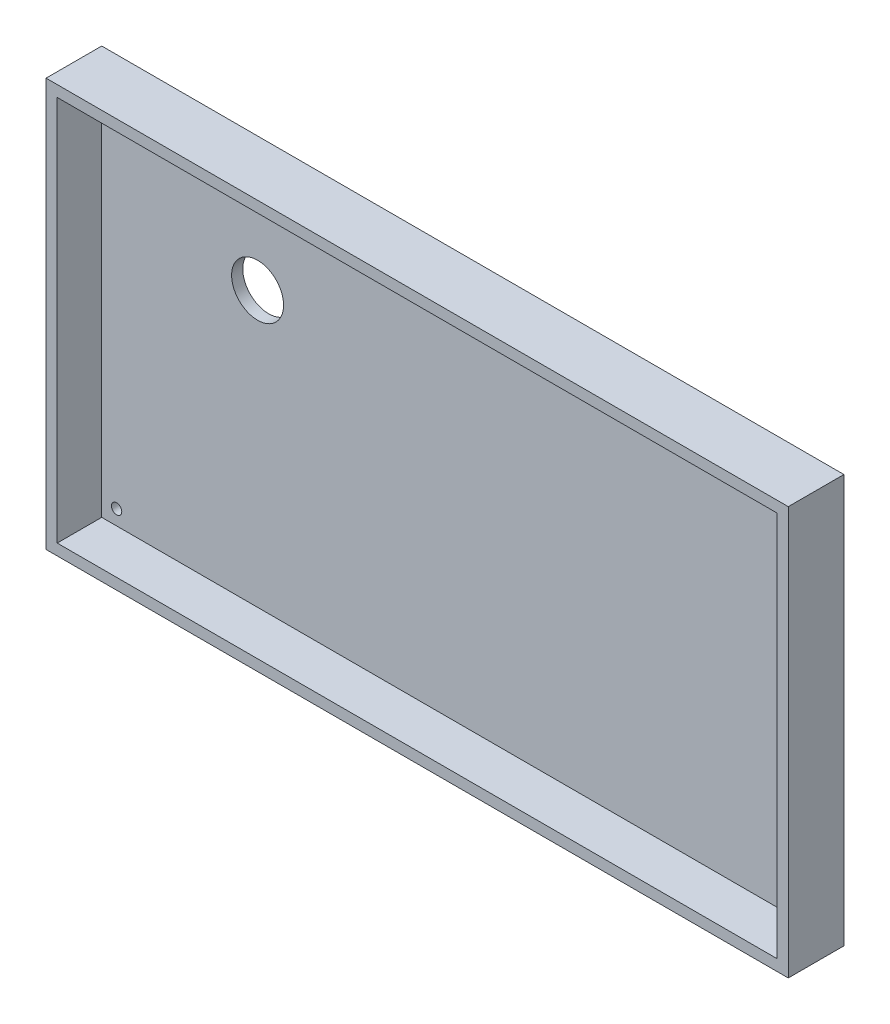
ISO-10303-21;
HEADER;
FILE_DESCRIPTION(('STEP AP214'),'2;1');
FILE_NAME('part.step','',(''),(''),'','','');
FILE_SCHEMA(('AUTOMOTIVE_DESIGN { 1 0 10303 214 1 1 1 1 }'));
ENDSEC;
DATA;
#1=APPLICATION_CONTEXT('core data for automotive mechanical design processes');
#2=APPLICATION_PROTOCOL_DEFINITION('international standard','automotive_design',2000,#1);
#3=PRODUCT_CONTEXT('',#1,'mechanical');
#4=PRODUCT('Part','Part','',(#3));
#5=PRODUCT_RELATED_PRODUCT_CATEGORY('part','',(#4));
#6=PRODUCT_DEFINITION_FORMATION('','',#4);
#7=PRODUCT_DEFINITION_CONTEXT('part definition',#1,'design');
#8=PRODUCT_DEFINITION('design','',#6,#7);
#9=PRODUCT_DEFINITION_SHAPE('','',#8);
#10=(LENGTH_UNIT() NAMED_UNIT(*) SI_UNIT(.MILLI.,.METRE.));
#11=(NAMED_UNIT(*) PLANE_ANGLE_UNIT() SI_UNIT($,.RADIAN.));
#12=(NAMED_UNIT(*) SI_UNIT($,.STERADIAN.) SOLID_ANGLE_UNIT());
#13=UNCERTAINTY_MEASURE_WITH_UNIT(LENGTH_MEASURE(1.E-05),#10,'distance_accuracy_value','');
#14=(GEOMETRIC_REPRESENTATION_CONTEXT(3) GLOBAL_UNCERTAINTY_ASSIGNED_CONTEXT((#13)) GLOBAL_UNIT_ASSIGNED_CONTEXT((#10,
#11,#12)) REPRESENTATION_CONTEXT('',''));
#15=CARTESIAN_POINT('',(0.,0.,0.));
#16=DIRECTION('',(0.,0.,1.));
#17=DIRECTION('',(1.,0.,0.));
#18=AXIS2_PLACEMENT_3D('',#15,#16,#17);
#19=CARTESIAN_POINT('',(-96.0084033613445,31.3025210084034,3.));
#20=DIRECTION('',(1.,0.,0.));
#21=DIRECTION('',(0.,0.,-1.));
#22=AXIS2_PLACEMENT_3D('',#19,#20,#21);
#23=PLANE('',#22);
#24=DIRECTION('',(0.,-1.,0.));
#25=VECTOR('',#24,1.);
#26=CARTESIAN_POINT('',(-96.0084033613445,31.3025210084034,0.));
#27=LINE('',#26,#25);
#28=CARTESIAN_POINT('',(-96.0084033613445,31.3025210084034,0.));
#29=VERTEX_POINT('',#28);
#30=CARTESIAN_POINT('',(-96.0084033613445,-78.6974789915967,0.));
#31=VERTEX_POINT('',#30);
#32=EDGE_CURVE('E158',#29,#31,#27,.T.);
#33=ORIENTED_EDGE('',*,*,#32,.T.);
#34=DIRECTION('',(0.,0.,-1.));
#35=VECTOR('',#34,1.);
#36=CARTESIAN_POINT('',(-96.0084033613445,-78.6974789915967,3.));
#37=LINE('',#36,#35);
#38=CARTESIAN_POINT('',(-96.0084033613445,-78.6974789915967,15.));
#39=VERTEX_POINT('',#38);
#40=EDGE_CURVE('E11',#39,#31,#37,.T.);
#41=ORIENTED_EDGE('',*,*,#40,.F.);
#42=DIRECTION('',(0.,-1.,0.));
#43=VECTOR('',#42,1.);
#44=CARTESIAN_POINT('',(-96.0084033613445,31.3025210084034,15.));
#45=LINE('',#44,#43);
#46=CARTESIAN_POINT('',(-96.0084033613445,31.3025210084034,15.));
#47=VERTEX_POINT('',#46);
#48=EDGE_CURVE('E121',#47,#39,#45,.T.);
#49=ORIENTED_EDGE('',*,*,#48,.F.);
#50=DIRECTION('',(0.,0.,-1.));
#51=VECTOR('',#50,1.);
#52=CARTESIAN_POINT('',(-96.0084033613445,31.3025210084034,3.));
#53=LINE('',#52,#51);
#54=EDGE_CURVE('E167',#47,#29,#53,.T.);
#55=ORIENTED_EDGE('',*,*,#54,.T.);
#56=EDGE_LOOP('',(#33,#41,#49,#55));
#57=FACE_BOUND('',#56,.T.);
#58=ADVANCED_FACE('F39',(#57),#23,.F.);
#59=CARTESIAN_POINT('',(-96.0084033613445,-78.6974789915967,3.));
#60=DIRECTION('',(0.,1.,0.));
#61=DIRECTION('',(0.,0.,1.));
#62=AXIS2_PLACEMENT_3D('',#59,#60,#61);
#63=PLANE('',#62);
#64=DIRECTION('',(1.,0.,0.));
#65=VECTOR('',#64,1.);
#66=CARTESIAN_POINT('',(-96.0084033613445,-78.6974789915967,0.));
#67=LINE('',#66,#65);
#68=CARTESIAN_POINT('',(103.991596638655,-78.6974789915967,0.));
#69=VERTEX_POINT('',#68);
#70=EDGE_CURVE('E161',#31,#69,#67,.T.);
#71=ORIENTED_EDGE('',*,*,#70,.T.);
#72=DIRECTION('',(0.,0.,-1.));
#73=VECTOR('',#72,1.);
#74=CARTESIAN_POINT('',(103.991596638655,-78.6974789915967,3.));
#75=LINE('',#74,#73);
#76=CARTESIAN_POINT('',(103.991596638655,-78.6974789915967,15.));
#77=VERTEX_POINT('',#76);
#78=EDGE_CURVE('E46',#77,#69,#75,.T.);
#79=ORIENTED_EDGE('',*,*,#78,.F.);
#80=DIRECTION('',(1.,0.,0.));
#81=VECTOR('',#80,1.);
#82=CARTESIAN_POINT('',(-96.0084033613445,-78.6974789915967,15.));
#83=LINE('',#82,#81);
#84=EDGE_CURVE('E149',#39,#77,#83,.T.);
#85=ORIENTED_EDGE('',*,*,#84,.F.);
#86=ORIENTED_EDGE('',*,*,#40,.T.);
#87=EDGE_LOOP('',(#71,#79,#85,#86));
#88=FACE_BOUND('',#87,.T.);
#89=ADVANCED_FACE('F184',(#88),#63,.F.);
#90=CARTESIAN_POINT('',(103.991596638655,31.3025210084034,3.));
#91=DIRECTION('',(-1.,0.,0.));
#92=DIRECTION('',(0.,-1.,0.));
#93=AXIS2_PLACEMENT_3D('',#90,#91,#92);
#94=PLANE('',#93);
#95=DIRECTION('',(0.,1.,0.));
#96=VECTOR('',#95,1.);
#97=CARTESIAN_POINT('',(103.991596638655,31.3025210084034,0.));
#98=LINE('',#97,#96);
#99=CARTESIAN_POINT('',(103.991596638655,31.3025210084034,0.));
#100=VERTEX_POINT('',#99);
#101=EDGE_CURVE('E162',#69,#100,#98,.T.);
#102=ORIENTED_EDGE('',*,*,#101,.T.);
#103=DIRECTION('',(0.,0.,-1.));
#104=VECTOR('',#103,1.);
#105=CARTESIAN_POINT('',(103.991596638655,31.3025210084034,3.));
#106=LINE('',#105,#104);
#107=CARTESIAN_POINT('',(103.991596638655,31.3025210084034,15.));
#108=VERTEX_POINT('',#107);
#109=EDGE_CURVE('E169',#108,#100,#106,.T.);
#110=ORIENTED_EDGE('',*,*,#109,.F.);
#111=DIRECTION('',(0.,1.,0.));
#112=VECTOR('',#111,1.);
#113=CARTESIAN_POINT('',(103.991596638655,31.3025210084034,15.));
#114=LINE('',#113,#112);
#115=EDGE_CURVE('E155',#77,#108,#114,.T.);
#116=ORIENTED_EDGE('',*,*,#115,.F.);
#117=ORIENTED_EDGE('',*,*,#78,.T.);
#118=EDGE_LOOP('',(#102,#110,#116,#117));
#119=FACE_BOUND('',#118,.T.);
#120=ADVANCED_FACE('F175',(#119),#94,.F.);
#121=CARTESIAN_POINT('',(-96.0084033613445,31.3025210084034,3.));
#122=DIRECTION('',(0.,-1.,0.));
#123=DIRECTION('',(0.,0.,-1.));
#124=AXIS2_PLACEMENT_3D('',#121,#122,#123);
#125=PLANE('',#124);
#126=DIRECTION('',(-1.,0.,0.));
#127=VECTOR('',#126,1.);
#128=CARTESIAN_POINT('',(-96.0084033613445,31.3025210084034,0.));
#129=LINE('',#128,#127);
#130=EDGE_CURVE('E64',#100,#29,#129,.T.);
#131=ORIENTED_EDGE('',*,*,#130,.T.);
#132=ORIENTED_EDGE('',*,*,#54,.F.);
#133=DIRECTION('',(-1.,0.,0.));
#134=VECTOR('',#133,1.);
#135=CARTESIAN_POINT('',(-96.0084033613445,31.3025210084034,15.));
#136=LINE('',#135,#134);
#137=EDGE_CURVE('E154',#108,#47,#136,.T.);
#138=ORIENTED_EDGE('',*,*,#137,.F.);
#139=ORIENTED_EDGE('',*,*,#109,.T.);
#140=EDGE_LOOP('',(#131,#132,#138,#139));
#141=FACE_BOUND('',#140,.T.);
#142=ADVANCED_FACE('F185',(#141),#125,.F.);
#143=CARTESIAN_POINT('',(0.,0.,0.));
#144=DIRECTION('',(0.,0.,1.));
#145=DIRECTION('',(1.,0.,0.));
#146=AXIS2_PLACEMENT_3D('',#143,#144,#145);
#147=PLANE('',#146);
#148=CARTESIAN_POINT('',(-51.0084033613446,-1.69747899159664,0.));
#149=DIRECTION('',(0.,0.,1.));
#150=DIRECTION('',(1.,0.,0.));
#151=AXIS2_PLACEMENT_3D('',#148,#149,#150);
#152=CIRCLE('',#151,7.);
#153=CARTESIAN_POINT('',(-44.0084033613446,-1.69747899159664,0.));
#154=VERTEX_POINT('',#153);
#155=EDGE_CURVE('E236',#154,#154,#152,.T.);
#156=ORIENTED_EDGE('',*,*,#155,.T.);
#157=EDGE_LOOP('',(#156));
#158=FACE_BOUND('',#157,.T.);
#159=CARTESIAN_POINT('',(-89.0084033613445,-71.6974789915967,0.));
#160=DIRECTION('',(0.,0.,1.));
#161=DIRECTION('',(1.,0.,0.));
#162=AXIS2_PLACEMENT_3D('',#159,#160,#161);
#163=CIRCLE('',#162,1.4);
#164=CARTESIAN_POINT('',(-87.6084033613445,-71.6974789915967,0.));
#165=VERTEX_POINT('',#164);
#166=EDGE_CURVE('E258',#165,#165,#163,.T.);
#167=ORIENTED_EDGE('',*,*,#166,.T.);
#168=EDGE_LOOP('',(#167));
#169=FACE_BOUND('',#168,.T.);
#170=CARTESIAN_POINT('',(96.9915966386555,24.3025210084034,0.));
#171=DIRECTION('',(0.,0.,1.));
#172=DIRECTION('',(1.,0.,0.));
#173=AXIS2_PLACEMENT_3D('',#170,#171,#172);
#174=CIRCLE('',#173,1.4);
#175=CARTESIAN_POINT('',(98.3915966386555,24.3025210084034,0.));
#176=VERTEX_POINT('',#175);
#177=EDGE_CURVE('E248',#176,#176,#174,.T.);
#178=ORIENTED_EDGE('',*,*,#177,.T.);
#179=EDGE_LOOP('',(#178));
#180=FACE_BOUND('',#179,.T.);
#181=CARTESIAN_POINT('',(96.9915966386555,-71.6974789915967,0.));
#182=DIRECTION('',(0.,0.,1.));
#183=DIRECTION('',(1.,0.,0.));
#184=AXIS2_PLACEMENT_3D('',#181,#182,#183);
#185=CIRCLE('',#184,1.4);
#186=CARTESIAN_POINT('',(98.3915966386555,-71.6974789915967,0.));
#187=VERTEX_POINT('',#186);
#188=EDGE_CURVE('E245',#187,#187,#185,.T.);
#189=ORIENTED_EDGE('',*,*,#188,.T.);
#190=EDGE_LOOP('',(#189));
#191=FACE_BOUND('',#190,.T.);
#192=CARTESIAN_POINT('',(-89.0084033613445,24.3025210084034,0.));
#193=DIRECTION('',(0.,0.,1.));
#194=DIRECTION('',(1.,0.,0.));
#195=AXIS2_PLACEMENT_3D('',#192,#193,#194);
#196=CIRCLE('',#195,1.4);
#197=CARTESIAN_POINT('',(-87.6084033613445,24.3025210084034,0.));
#198=VERTEX_POINT('',#197);
#199=EDGE_CURVE('E136',#198,#198,#196,.T.);
#200=ORIENTED_EDGE('',*,*,#199,.T.);
#201=EDGE_LOOP('',(#200));
#202=FACE_BOUND('',#201,.T.);
#203=ORIENTED_EDGE('',*,*,#32,.F.);
#204=ORIENTED_EDGE('',*,*,#130,.F.);
#205=ORIENTED_EDGE('',*,*,#101,.F.);
#206=ORIENTED_EDGE('',*,*,#70,.F.);
#207=EDGE_LOOP('',(#203,#204,#205,#206));
#208=FACE_BOUND('',#207,.T.);
#209=ADVANCED_FACE('F179',(#158,#169,#180,#191,#202,#208),#147,.F.);
#210=CARTESIAN_POINT('',(0.,0.,15.));
#211=DIRECTION('',(0.,0.,1.));
#212=DIRECTION('',(1.,0.,0.));
#213=AXIS2_PLACEMENT_3D('',#210,#211,#212);
#214=PLANE('',#213);
#215=ORIENTED_EDGE('',*,*,#48,.T.);
#216=ORIENTED_EDGE('',*,*,#84,.T.);
#217=ORIENTED_EDGE('',*,*,#115,.T.);
#218=ORIENTED_EDGE('',*,*,#137,.T.);
#219=EDGE_LOOP('',(#215,#216,#217,#218));
#220=FACE_BOUND('',#219,.T.);
#221=DIRECTION('',(1.,0.,0.));
#222=VECTOR('',#221,1.);
#223=CARTESIAN_POINT('',(-93.0084033613445,-75.6974789915967,15.));
#224=LINE('',#223,#222);
#225=CARTESIAN_POINT('',(-93.0084033613445,-75.6974789915967,15.));
#226=VERTEX_POINT('',#225);
#227=CARTESIAN_POINT('',(100.991596638655,-75.6974789915967,15.));
#228=VERTEX_POINT('',#227);
#229=EDGE_CURVE('E114',#226,#228,#224,.T.);
#230=ORIENTED_EDGE('',*,*,#229,.F.);
#231=DIRECTION('',(0.,-1.,0.));
#232=VECTOR('',#231,1.);
#233=CARTESIAN_POINT('',(-93.0084033613445,28.3025210084034,15.));
#234=LINE('',#233,#232);
#235=CARTESIAN_POINT('',(-93.0084033613445,28.3025210084034,15.));
#236=VERTEX_POINT('',#235);
#237=EDGE_CURVE('E104',#236,#226,#234,.T.);
#238=ORIENTED_EDGE('',*,*,#237,.F.);
#239=DIRECTION('',(-1.,0.,0.));
#240=VECTOR('',#239,1.);
#241=CARTESIAN_POINT('',(-93.0084033613445,28.3025210084034,15.));
#242=LINE('',#241,#240);
#243=CARTESIAN_POINT('',(100.991596638655,28.3025210084034,15.));
#244=VERTEX_POINT('',#243);
#245=EDGE_CURVE('E129',#244,#236,#242,.T.);
#246=ORIENTED_EDGE('',*,*,#245,.F.);
#247=DIRECTION('',(0.,1.,0.));
#248=VECTOR('',#247,1.);
#249=CARTESIAN_POINT('',(100.991596638655,28.3025210084034,15.));
#250=LINE('',#249,#248);
#251=EDGE_CURVE('E130',#228,#244,#250,.T.);
#252=ORIENTED_EDGE('',*,*,#251,.F.);
#253=EDGE_LOOP('',(#230,#238,#246,#252));
#254=FACE_BOUND('',#253,.T.);
#255=ADVANCED_FACE('F125',(#220,#254),#214,.T.);
#256=CARTESIAN_POINT('',(-93.0084033613445,28.3025210084034,15.));
#257=DIRECTION('',(1.,0.,0.));
#258=DIRECTION('',(0.,1.,0.));
#259=AXIS2_PLACEMENT_3D('',#256,#257,#258);
#260=PLANE('',#259);
#261=DIRECTION('',(0.,-1.,0.));
#262=VECTOR('',#261,1.);
#263=CARTESIAN_POINT('',(-93.0084033613445,28.3025210084034,3.));
#264=LINE('',#263,#262);
#265=CARTESIAN_POINT('',(-93.0084033613445,28.3025210084034,3.));
#266=VERTEX_POINT('',#265);
#267=CARTESIAN_POINT('',(-93.0084033613445,-75.6974789915967,3.));
#268=VERTEX_POINT('',#267);
#269=EDGE_CURVE('E133',#266,#268,#264,.T.);
#270=ORIENTED_EDGE('',*,*,#269,.F.);
#271=DIRECTION('',(0.,0.,-1.));
#272=VECTOR('',#271,1.);
#273=CARTESIAN_POINT('',(-93.0084033613445,28.3025210084034,15.));
#274=LINE('',#273,#272);
#275=EDGE_CURVE('E52',#236,#266,#274,.T.);
#276=ORIENTED_EDGE('',*,*,#275,.F.);
#277=ORIENTED_EDGE('',*,*,#237,.T.);
#278=DIRECTION('',(0.,0.,-1.));
#279=VECTOR('',#278,1.);
#280=CARTESIAN_POINT('',(-93.0084033613445,-75.6974789915967,15.));
#281=LINE('',#280,#279);
#282=EDGE_CURVE('E107',#226,#268,#281,.T.);
#283=ORIENTED_EDGE('',*,*,#282,.T.);
#284=EDGE_LOOP('',(#270,#276,#277,#283));
#285=FACE_BOUND('',#284,.T.);
#286=ADVANCED_FACE('F110',(#285),#260,.T.);
#287=CARTESIAN_POINT('',(-93.0084033613445,-75.6974789915967,15.));
#288=DIRECTION('',(0.,1.,0.));
#289=DIRECTION('',(0.,0.,1.));
#290=AXIS2_PLACEMENT_3D('',#287,#288,#289);
#291=PLANE('',#290);
#292=DIRECTION('',(1.,0.,0.));
#293=VECTOR('',#292,1.);
#294=CARTESIAN_POINT('',(-93.0084033613445,-75.6974789915967,3.));
#295=LINE('',#294,#293);
#296=CARTESIAN_POINT('',(100.991596638655,-75.6974789915967,3.));
#297=VERTEX_POINT('',#296);
#298=EDGE_CURVE('E117',#268,#297,#295,.T.);
#299=ORIENTED_EDGE('',*,*,#298,.F.);
#300=ORIENTED_EDGE('',*,*,#282,.F.);
#301=ORIENTED_EDGE('',*,*,#229,.T.);
#302=DIRECTION('',(0.,0.,-1.));
#303=VECTOR('',#302,1.);
#304=CARTESIAN_POINT('',(100.991596638655,-75.6974789915967,15.));
#305=LINE('',#304,#303);
#306=EDGE_CURVE('E122',#228,#297,#305,.T.);
#307=ORIENTED_EDGE('',*,*,#306,.T.);
#308=EDGE_LOOP('',(#299,#300,#301,#307));
#309=FACE_BOUND('',#308,.T.);
#310=ADVANCED_FACE('F116',(#309),#291,.T.);
#311=CARTESIAN_POINT('',(100.991596638655,28.3025210084034,15.));
#312=DIRECTION('',(-1.,0.,0.));
#313=DIRECTION('',(0.,-1.,0.));
#314=AXIS2_PLACEMENT_3D('',#311,#312,#313);
#315=PLANE('',#314);
#316=DIRECTION('',(0.,1.,0.));
#317=VECTOR('',#316,1.);
#318=CARTESIAN_POINT('',(100.991596638655,28.3025210084034,3.));
#319=LINE('',#318,#317);
#320=CARTESIAN_POINT('',(100.991596638655,28.3025210084034,3.));
#321=VERTEX_POINT('',#320);
#322=EDGE_CURVE('E139',#297,#321,#319,.T.);
#323=ORIENTED_EDGE('',*,*,#322,.F.);
#324=ORIENTED_EDGE('',*,*,#306,.F.);
#325=ORIENTED_EDGE('',*,*,#251,.T.);
#326=DIRECTION('',(0.,0.,-1.));
#327=VECTOR('',#326,1.);
#328=CARTESIAN_POINT('',(100.991596638655,28.3025210084034,15.));
#329=LINE('',#328,#327);
#330=EDGE_CURVE('E145',#244,#321,#329,.T.);
#331=ORIENTED_EDGE('',*,*,#330,.T.);
#332=EDGE_LOOP('',(#323,#324,#325,#331));
#333=FACE_BOUND('',#332,.T.);
#334=ADVANCED_FACE('F207',(#333),#315,.T.);
#335=CARTESIAN_POINT('',(-93.0084033613445,28.3025210084034,15.));
#336=DIRECTION('',(0.,-1.,0.));
#337=DIRECTION('',(0.,0.,-1.));
#338=AXIS2_PLACEMENT_3D('',#335,#336,#337);
#339=PLANE('',#338);
#340=DIRECTION('',(-1.,0.,0.));
#341=VECTOR('',#340,1.);
#342=CARTESIAN_POINT('',(-93.0084033613445,28.3025210084034,3.));
#343=LINE('',#342,#341);
#344=EDGE_CURVE('E111',#321,#266,#343,.T.);
#345=ORIENTED_EDGE('',*,*,#344,.F.);
#346=ORIENTED_EDGE('',*,*,#330,.F.);
#347=ORIENTED_EDGE('',*,*,#245,.T.);
#348=ORIENTED_EDGE('',*,*,#275,.T.);
#349=EDGE_LOOP('',(#345,#346,#347,#348));
#350=FACE_BOUND('',#349,.T.);
#351=ADVANCED_FACE('F203',(#350),#339,.T.);
#352=CARTESIAN_POINT('',(0.,0.,3.));
#353=DIRECTION('',(0.,0.,1.));
#354=DIRECTION('',(1.,0.,0.));
#355=AXIS2_PLACEMENT_3D('',#352,#353,#354);
#356=PLANE('',#355);
#357=CARTESIAN_POINT('',(-51.0084033613446,-1.69747899159664,3.));
#358=DIRECTION('',(0.,0.,1.));
#359=DIRECTION('',(1.,0.,0.));
#360=AXIS2_PLACEMENT_3D('',#357,#358,#359);
#361=CIRCLE('',#360,7.);
#362=CARTESIAN_POINT('',(-44.0084033613446,-1.69747899159664,3.));
#363=VERTEX_POINT('',#362);
#364=EDGE_CURVE('E244',#363,#363,#361,.T.);
#365=ORIENTED_EDGE('',*,*,#364,.F.);
#366=EDGE_LOOP('',(#365));
#367=FACE_BOUND('',#366,.T.);
#368=CARTESIAN_POINT('',(-89.0084033613445,-71.6974789915967,3.));
#369=DIRECTION('',(0.,0.,1.));
#370=DIRECTION('',(1.,0.,0.));
#371=AXIS2_PLACEMENT_3D('',#368,#369,#370);
#372=CIRCLE('',#371,1.4);
#373=CARTESIAN_POINT('',(-87.6084033613445,-71.6974789915967,3.));
#374=VERTEX_POINT('',#373);
#375=EDGE_CURVE('E252',#374,#374,#372,.T.);
#376=ORIENTED_EDGE('',*,*,#375,.F.);
#377=EDGE_LOOP('',(#376));
#378=FACE_BOUND('',#377,.T.);
#379=CARTESIAN_POINT('',(96.9915966386555,24.3025210084034,3.));
#380=DIRECTION('',(0.,0.,1.));
#381=DIRECTION('',(1.,0.,0.));
#382=AXIS2_PLACEMENT_3D('',#379,#380,#381);
#383=CIRCLE('',#382,1.4);
#384=CARTESIAN_POINT('',(98.3915966386555,24.3025210084034,3.));
#385=VERTEX_POINT('',#384);
#386=EDGE_CURVE('E259',#385,#385,#383,.T.);
#387=ORIENTED_EDGE('',*,*,#386,.F.);
#388=EDGE_LOOP('',(#387));
#389=FACE_BOUND('',#388,.T.);
#390=CARTESIAN_POINT('',(96.9915966386555,-71.6974789915967,3.));
#391=DIRECTION('',(0.,0.,1.));
#392=DIRECTION('',(1.,0.,0.));
#393=AXIS2_PLACEMENT_3D('',#390,#391,#392);
#394=CIRCLE('',#393,1.4);
#395=CARTESIAN_POINT('',(98.3915966386555,-71.6974789915967,3.));
#396=VERTEX_POINT('',#395);
#397=EDGE_CURVE('E246',#396,#396,#394,.T.);
#398=ORIENTED_EDGE('',*,*,#397,.F.);
#399=EDGE_LOOP('',(#398));
#400=FACE_BOUND('',#399,.T.);
#401=CARTESIAN_POINT('',(-89.0084033613445,24.3025210084034,3.));
#402=DIRECTION('',(0.,0.,1.));
#403=DIRECTION('',(1.,0.,0.));
#404=AXIS2_PLACEMENT_3D('',#401,#402,#403);
#405=CIRCLE('',#404,1.4);
#406=CARTESIAN_POINT('',(-87.6084033613445,24.3025210084034,3.));
#407=VERTEX_POINT('',#406);
#408=EDGE_CURVE('E254',#407,#407,#405,.T.);
#409=ORIENTED_EDGE('',*,*,#408,.F.);
#410=EDGE_LOOP('',(#409));
#411=FACE_BOUND('',#410,.T.);
#412=ORIENTED_EDGE('',*,*,#344,.T.);
#413=ORIENTED_EDGE('',*,*,#269,.T.);
#414=ORIENTED_EDGE('',*,*,#298,.T.);
#415=ORIENTED_EDGE('',*,*,#322,.T.);
#416=EDGE_LOOP('',(#412,#413,#414,#415));
#417=FACE_BOUND('',#416,.T.);
#418=ADVANCED_FACE('F197',(#367,#378,#389,#400,#411,#417),#356,.T.);
#419=CARTESIAN_POINT('',(-89.0084033613445,24.3025210084034,0.));
#420=DIRECTION('',(0.,0.,1.));
#421=DIRECTION('',(1.,0.,0.));
#422=AXIS2_PLACEMENT_3D('',#419,#420,#421);
#423=CYLINDRICAL_SURFACE('',#422,1.4);
#424=ORIENTED_EDGE('',*,*,#199,.F.);
#425=EDGE_LOOP('',(#424));
#426=FACE_BOUND('',#425,.T.);
#427=ORIENTED_EDGE('',*,*,#408,.T.);
#428=EDGE_LOOP('',(#427));
#429=FACE_BOUND('',#428,.T.);
#430=ADVANCED_FACE('F199',(#426,#429),#423,.F.);
#431=CARTESIAN_POINT('',(96.9915966386555,-71.6974789915967,0.));
#432=DIRECTION('',(0.,0.,1.));
#433=DIRECTION('',(1.,0.,0.));
#434=AXIS2_PLACEMENT_3D('',#431,#432,#433);
#435=CYLINDRICAL_SURFACE('',#434,1.4);
#436=ORIENTED_EDGE('',*,*,#188,.F.);
#437=EDGE_LOOP('',(#436));
#438=FACE_BOUND('',#437,.T.);
#439=ORIENTED_EDGE('',*,*,#397,.T.);
#440=EDGE_LOOP('',(#439));
#441=FACE_BOUND('',#440,.T.);
#442=ADVANCED_FACE('F220',(#438,#441),#435,.F.);
#443=CARTESIAN_POINT('',(96.9915966386555,24.3025210084034,0.));
#444=DIRECTION('',(0.,0.,1.));
#445=DIRECTION('',(1.,0.,0.));
#446=AXIS2_PLACEMENT_3D('',#443,#444,#445);
#447=CYLINDRICAL_SURFACE('',#446,1.4);
#448=ORIENTED_EDGE('',*,*,#177,.F.);
#449=EDGE_LOOP('',(#448));
#450=FACE_BOUND('',#449,.T.);
#451=ORIENTED_EDGE('',*,*,#386,.T.);
#452=EDGE_LOOP('',(#451));
#453=FACE_BOUND('',#452,.T.);
#454=ADVANCED_FACE('F218',(#450,#453),#447,.F.);
#455=CARTESIAN_POINT('',(-89.0084033613445,-71.6974789915967,0.));
#456=DIRECTION('',(0.,0.,1.));
#457=DIRECTION('',(1.,0.,0.));
#458=AXIS2_PLACEMENT_3D('',#455,#456,#457);
#459=CYLINDRICAL_SURFACE('',#458,1.4);
#460=ORIENTED_EDGE('',*,*,#166,.F.);
#461=EDGE_LOOP('',(#460));
#462=FACE_BOUND('',#461,.T.);
#463=ORIENTED_EDGE('',*,*,#375,.T.);
#464=EDGE_LOOP('',(#463));
#465=FACE_BOUND('',#464,.T.);
#466=ADVANCED_FACE('F225',(#462,#465),#459,.F.);
#467=CARTESIAN_POINT('',(-51.0084033613446,-1.69747899159664,0.));
#468=DIRECTION('',(0.,0.,1.));
#469=DIRECTION('',(1.,0.,0.));
#470=AXIS2_PLACEMENT_3D('',#467,#468,#469);
#471=CYLINDRICAL_SURFACE('',#470,7.);
#472=ORIENTED_EDGE('',*,*,#155,.F.);
#473=EDGE_LOOP('',(#472));
#474=FACE_BOUND('',#473,.T.);
#475=ORIENTED_EDGE('',*,*,#364,.T.);
#476=EDGE_LOOP('',(#475));
#477=FACE_BOUND('',#476,.T.);
#478=ADVANCED_FACE('F229',(#474,#477),#471,.F.);
#479=CLOSED_SHELL('',(#58,#89,#120,#142,#209,#255,#286,#310,#334,#351,#418,#430,#442,#454,#466,#478));
#480=MANIFOLD_SOLID_BREP('B2',#479);
#481=ADVANCED_BREP_SHAPE_REPRESENTATION('',(#18,#480),#14);
#482=SHAPE_DEFINITION_REPRESENTATION(#9,#481);
ENDSEC;
END-ISO-10303-21;
